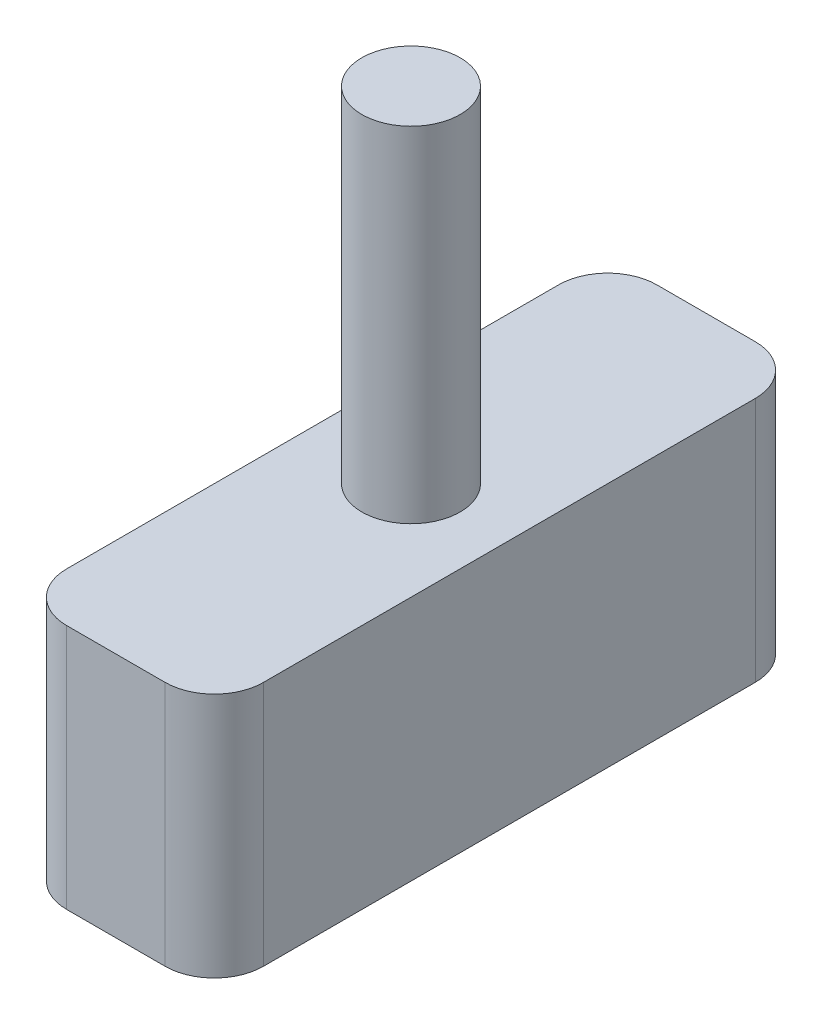
ISO-10303-21;
HEADER;
FILE_DESCRIPTION(('STEP AP214'),'2;1');
FILE_NAME('part.step','',(''),(''),'','','');
FILE_SCHEMA(('AUTOMOTIVE_DESIGN { 1 0 10303 214 1 1 1 1 }'));
ENDSEC;
DATA;
#1=APPLICATION_CONTEXT('core data for automotive mechanical design processes');
#2=APPLICATION_PROTOCOL_DEFINITION('international standard','automotive_design',2000,#1);
#3=PRODUCT_CONTEXT('',#1,'mechanical');
#4=PRODUCT('Part','Part','',(#3));
#5=PRODUCT_RELATED_PRODUCT_CATEGORY('part','',(#4));
#6=PRODUCT_DEFINITION_FORMATION('','',#4);
#7=PRODUCT_DEFINITION_CONTEXT('part definition',#1,'design');
#8=PRODUCT_DEFINITION('design','',#6,#7);
#9=PRODUCT_DEFINITION_SHAPE('','',#8);
#10=(LENGTH_UNIT() NAMED_UNIT(*) SI_UNIT(.MILLI.,.METRE.));
#11=(NAMED_UNIT(*) PLANE_ANGLE_UNIT() SI_UNIT($,.RADIAN.));
#12=(NAMED_UNIT(*) SI_UNIT($,.STERADIAN.) SOLID_ANGLE_UNIT());
#13=UNCERTAINTY_MEASURE_WITH_UNIT(LENGTH_MEASURE(1.E-05),#10,'distance_accuracy_value','');
#14=(GEOMETRIC_REPRESENTATION_CONTEXT(3) GLOBAL_UNCERTAINTY_ASSIGNED_CONTEXT((#13)) GLOBAL_UNIT_ASSIGNED_CONTEXT((#10,
#11,#12)) REPRESENTATION_CONTEXT('',''));
#15=CARTESIAN_POINT('',(0.,0.,0.));
#16=DIRECTION('',(0.,0.,1.));
#17=DIRECTION('',(1.,0.,0.));
#18=AXIS2_PLACEMENT_3D('',#15,#16,#17);
#19=CARTESIAN_POINT('',(0.,7.,0.));
#20=DIRECTION('',(0.,1.,0.));
#21=DIRECTION('',(-1.,0.,0.));
#22=AXIS2_PLACEMENT_3D('',#19,#20,#21);
#23=CYLINDRICAL_SURFACE('',#22,1.);
#24=CARTESIAN_POINT('',(0.,7.,0.));
#25=DIRECTION('',(0.,1.,0.));
#26=DIRECTION('',(-1.,0.,0.));
#27=AXIS2_PLACEMENT_3D('',#24,#25,#26);
#28=CIRCLE('',#27,1.);
#29=CARTESIAN_POINT('',(-1.,7.,0.));
#30=VERTEX_POINT('',#29);
#31=EDGE_CURVE('E11',#30,#30,#28,.T.);
#32=ORIENTED_EDGE('',*,*,#31,.F.);
#33=EDGE_LOOP('',(#32));
#34=FACE_BOUND('',#33,.T.);
#35=CARTESIAN_POINT('',(0.,0.,0.));
#36=DIRECTION('',(0.,1.,0.));
#37=DIRECTION('',(-1.,0.,0.));
#38=AXIS2_PLACEMENT_3D('',#35,#36,#37);
#39=CIRCLE('',#38,1.);
#40=CARTESIAN_POINT('',(-1.,0.,0.));
#41=VERTEX_POINT('',#40);
#42=EDGE_CURVE('E48',#41,#41,#39,.T.);
#43=ORIENTED_EDGE('',*,*,#42,.T.);
#44=EDGE_LOOP('',(#43));
#45=FACE_BOUND('',#44,.T.);
#46=ADVANCED_FACE('F45',(#34,#45),#23,.T.);
#47=CARTESIAN_POINT('',(0.,7.,0.));
#48=DIRECTION('',(0.,-1.,0.));
#49=DIRECTION('',(1.,0.,0.));
#50=AXIS2_PLACEMENT_3D('',#47,#48,#49);
#51=PLANE('',#50);
#52=ORIENTED_EDGE('',*,*,#31,.T.);
#53=EDGE_LOOP('',(#52));
#54=FACE_BOUND('',#53,.T.);
#55=ADVANCED_FACE('F232',(#54),#51,.F.);
#56=CARTESIAN_POINT('',(-2.,-5.,-4.99999999999999));
#57=DIRECTION('',(-1.,0.,0.));
#58=DIRECTION('',(0.,0.,1.));
#59=AXIS2_PLACEMENT_3D('',#56,#57,#58);
#60=PLANE('',#59);
#61=DIRECTION('',(0.,0.,1.));
#62=VECTOR('',#61,1.);
#63=CARTESIAN_POINT('',(-2.,0.,-4.99999999999999));
#64=LINE('',#63,#62);
#65=CARTESIAN_POINT('',(-2.,0.,-4.99999999999999));
#66=VERTEX_POINT('',#65);
#67=CARTESIAN_POINT('',(-2.00000000000001,0.,5.00000000000002));
#68=VERTEX_POINT('',#67);
#69=EDGE_CURVE('E147',#66,#68,#64,.T.);
#70=ORIENTED_EDGE('',*,*,#69,.F.);
#71=DIRECTION('',(0.,1.,0.));
#72=VECTOR('',#71,1.);
#73=CARTESIAN_POINT('',(-2.,-5.,-4.99999999999999));
#74=LINE('',#73,#72);
#75=CARTESIAN_POINT('',(-2.,-5.,-4.99999999999999));
#76=VERTEX_POINT('',#75);
#77=EDGE_CURVE('E62',#76,#66,#74,.T.);
#78=ORIENTED_EDGE('',*,*,#77,.F.);
#79=DIRECTION('',(0.,0.,1.));
#80=VECTOR('',#79,1.);
#81=CARTESIAN_POINT('',(-2.,-5.,-4.99999999999999));
#82=LINE('',#81,#80);
#83=CARTESIAN_POINT('',(-2.00000000000001,-5.,5.00000000000002));
#84=VERTEX_POINT('',#83);
#85=EDGE_CURVE('E173',#76,#84,#82,.T.);
#86=ORIENTED_EDGE('',*,*,#85,.T.);
#87=DIRECTION('',(0.,1.,0.));
#88=VECTOR('',#87,1.);
#89=CARTESIAN_POINT('',(-2.00000000000001,-5.,5.00000000000002));
#90=LINE('',#89,#88);
#91=EDGE_CURVE('E103',#84,#68,#90,.T.);
#92=ORIENTED_EDGE('',*,*,#91,.T.);
#93=EDGE_LOOP('',(#70,#78,#86,#92));
#94=FACE_BOUND('',#93,.T.);
#95=ADVANCED_FACE('F192',(#94),#60,.T.);
#96=CARTESIAN_POINT('',(-1.,-5.,-4.99999999999999));
#97=DIRECTION('',(0.,1.,0.));
#98=DIRECTION('',(-1.,0.,0.));
#99=AXIS2_PLACEMENT_3D('',#96,#97,#98);
#100=CYLINDRICAL_SURFACE('',#99,1.);
#101=CARTESIAN_POINT('',(-1.,0.,-4.99999999999999));
#102=DIRECTION('',(0.,-1.,0.));
#103=DIRECTION('',(1.,0.,0.));
#104=AXIS2_PLACEMENT_3D('',#101,#102,#103);
#105=CIRCLE('',#104,1.);
#106=CARTESIAN_POINT('',(-1.,0.,-5.99999999999999));
#107=VERTEX_POINT('',#106);
#108=EDGE_CURVE('E170',#66,#107,#105,.T.);
#109=ORIENTED_EDGE('',*,*,#108,.T.);
#110=DIRECTION('',(0.,1.,0.));
#111=VECTOR('',#110,1.);
#112=CARTESIAN_POINT('',(-1.,-5.,-5.99999999999999));
#113=LINE('',#112,#111);
#114=CARTESIAN_POINT('',(-1.,-5.,-5.99999999999999));
#115=VERTEX_POINT('',#114);
#116=EDGE_CURVE('E92',#115,#107,#113,.T.);
#117=ORIENTED_EDGE('',*,*,#116,.F.);
#118=CARTESIAN_POINT('',(-1.,-5.,-4.99999999999999));
#119=DIRECTION('',(0.,-1.,0.));
#120=DIRECTION('',(1.,0.,0.));
#121=AXIS2_PLACEMENT_3D('',#118,#119,#120);
#122=CIRCLE('',#121,1.);
#123=EDGE_CURVE('E140',#76,#115,#122,.T.);
#124=ORIENTED_EDGE('',*,*,#123,.F.);
#125=ORIENTED_EDGE('',*,*,#77,.T.);
#126=EDGE_LOOP('',(#109,#117,#124,#125));
#127=FACE_BOUND('',#126,.T.);
#128=ADVANCED_FACE('F198',(#127),#100,.T.);
#129=CARTESIAN_POINT('',(1.,-5.,-5.99999999999999));
#130=DIRECTION('',(0.,0.,-1.));
#131=DIRECTION('',(-1.,0.,0.));
#132=AXIS2_PLACEMENT_3D('',#129,#130,#131);
#133=PLANE('',#132);
#134=DIRECTION('',(-1.,0.,0.));
#135=VECTOR('',#134,1.);
#136=CARTESIAN_POINT('',(1.,0.,-5.99999999999999));
#137=LINE('',#136,#135);
#138=CARTESIAN_POINT('',(1.,0.,-5.99999999999999));
#139=VERTEX_POINT('',#138);
#140=EDGE_CURVE('E123',#139,#107,#137,.T.);
#141=ORIENTED_EDGE('',*,*,#140,.F.);
#142=DIRECTION('',(0.,1.,0.));
#143=VECTOR('',#142,1.);
#144=CARTESIAN_POINT('',(1.,-5.,-5.99999999999999));
#145=LINE('',#144,#143);
#146=CARTESIAN_POINT('',(1.,-5.,-5.99999999999999));
#147=VERTEX_POINT('',#146);
#148=EDGE_CURVE('E117',#147,#139,#145,.T.);
#149=ORIENTED_EDGE('',*,*,#148,.F.);
#150=DIRECTION('',(-1.,0.,0.));
#151=VECTOR('',#150,1.);
#152=CARTESIAN_POINT('',(1.,-5.,-5.99999999999999));
#153=LINE('',#152,#151);
#154=EDGE_CURVE('E121',#147,#115,#153,.T.);
#155=ORIENTED_EDGE('',*,*,#154,.T.);
#156=ORIENTED_EDGE('',*,*,#116,.T.);
#157=EDGE_LOOP('',(#141,#149,#155,#156));
#158=FACE_BOUND('',#157,.T.);
#159=ADVANCED_FACE('F119',(#158),#133,.T.);
#160=CARTESIAN_POINT('',(1.,-5.,-4.99999999999999));
#161=DIRECTION('',(0.,1.,0.));
#162=DIRECTION('',(-1.,0.,0.));
#163=AXIS2_PLACEMENT_3D('',#160,#161,#162);
#164=CYLINDRICAL_SURFACE('',#163,1.);
#165=CARTESIAN_POINT('',(1.,0.,-4.99999999999999));
#166=DIRECTION('',(0.,-1.,0.));
#167=DIRECTION('',(1.,0.,0.));
#168=AXIS2_PLACEMENT_3D('',#165,#166,#167);
#169=CIRCLE('',#168,1.);
#170=CARTESIAN_POINT('',(2.,0.,-4.99999999999999));
#171=VERTEX_POINT('',#170);
#172=EDGE_CURVE('E165',#139,#171,#169,.T.);
#173=ORIENTED_EDGE('',*,*,#172,.T.);
#174=DIRECTION('',(0.,1.,0.));
#175=VECTOR('',#174,1.);
#176=CARTESIAN_POINT('',(2.,-5.,-4.99999999999999));
#177=LINE('',#176,#175);
#178=CARTESIAN_POINT('',(2.,-5.,-4.99999999999999));
#179=VERTEX_POINT('',#178);
#180=EDGE_CURVE('E127',#179,#171,#177,.T.);
#181=ORIENTED_EDGE('',*,*,#180,.F.);
#182=CARTESIAN_POINT('',(1.,-5.,-4.99999999999999));
#183=DIRECTION('',(0.,-1.,0.));
#184=DIRECTION('',(1.,0.,0.));
#185=AXIS2_PLACEMENT_3D('',#182,#183,#184);
#186=CIRCLE('',#185,1.);
#187=EDGE_CURVE('E130',#147,#179,#186,.T.);
#188=ORIENTED_EDGE('',*,*,#187,.F.);
#189=ORIENTED_EDGE('',*,*,#148,.T.);
#190=EDGE_LOOP('',(#173,#181,#188,#189));
#191=FACE_BOUND('',#190,.T.);
#192=ADVANCED_FACE('F131',(#191),#164,.T.);
#193=CARTESIAN_POINT('',(2.,-5.,-4.99999999999999));
#194=DIRECTION('',(-1.,0.,0.));
#195=DIRECTION('',(0.,-1.,0.));
#196=AXIS2_PLACEMENT_3D('',#193,#194,#195);
#197=PLANE('',#196);
#198=DIRECTION('',(0.,0.,1.));
#199=VECTOR('',#198,1.);
#200=CARTESIAN_POINT('',(2.,0.,-4.99999999999999));
#201=LINE('',#200,#199);
#202=CARTESIAN_POINT('',(2.,0.,5.00000000000002));
#203=VERTEX_POINT('',#202);
#204=EDGE_CURVE('E162',#171,#203,#201,.T.);
#205=ORIENTED_EDGE('',*,*,#204,.T.);
#206=DIRECTION('',(0.,1.,0.));
#207=VECTOR('',#206,1.);
#208=CARTESIAN_POINT('',(2.,-5.,5.00000000000002));
#209=LINE('',#208,#207);
#210=CARTESIAN_POINT('',(2.,-5.,5.00000000000002));
#211=VERTEX_POINT('',#210);
#212=EDGE_CURVE('E180',#211,#203,#209,.T.);
#213=ORIENTED_EDGE('',*,*,#212,.F.);
#214=DIRECTION('',(0.,0.,1.));
#215=VECTOR('',#214,1.);
#216=CARTESIAN_POINT('',(2.,-5.,-4.99999999999999));
#217=LINE('',#216,#215);
#218=EDGE_CURVE('E136',#179,#211,#217,.T.);
#219=ORIENTED_EDGE('',*,*,#218,.F.);
#220=ORIENTED_EDGE('',*,*,#180,.T.);
#221=EDGE_LOOP('',(#205,#213,#219,#220));
#222=FACE_BOUND('',#221,.T.);
#223=ADVANCED_FACE('F215',(#222),#197,.F.);
#224=CARTESIAN_POINT('',(1.,-5.,5.00000000000002));
#225=DIRECTION('',(0.,1.,0.));
#226=DIRECTION('',(-1.,0.,0.));
#227=AXIS2_PLACEMENT_3D('',#224,#225,#226);
#228=CYLINDRICAL_SURFACE('',#227,1.);
#229=CARTESIAN_POINT('',(1.,0.,5.00000000000002));
#230=DIRECTION('',(0.,-1.,0.));
#231=DIRECTION('',(1.,0.,0.));
#232=AXIS2_PLACEMENT_3D('',#229,#230,#231);
#233=CIRCLE('',#232,1.);
#234=CARTESIAN_POINT('',(1.,0.,6.00000000000002));
#235=VERTEX_POINT('',#234);
#236=EDGE_CURVE('E159',#203,#235,#233,.T.);
#237=ORIENTED_EDGE('',*,*,#236,.T.);
#238=DIRECTION('',(0.,1.,0.));
#239=VECTOR('',#238,1.);
#240=CARTESIAN_POINT('',(1.,-5.,6.00000000000002));
#241=LINE('',#240,#239);
#242=CARTESIAN_POINT('',(1.,-5.,6.00000000000002));
#243=VERTEX_POINT('',#242);
#244=EDGE_CURVE('E184',#243,#235,#241,.T.);
#245=ORIENTED_EDGE('',*,*,#244,.F.);
#246=CARTESIAN_POINT('',(1.,-5.,5.00000000000002));
#247=DIRECTION('',(0.,-1.,0.));
#248=DIRECTION('',(1.,0.,0.));
#249=AXIS2_PLACEMENT_3D('',#246,#247,#248);
#250=CIRCLE('',#249,1.);
#251=EDGE_CURVE('E208',#211,#243,#250,.T.);
#252=ORIENTED_EDGE('',*,*,#251,.F.);
#253=ORIENTED_EDGE('',*,*,#212,.T.);
#254=EDGE_LOOP('',(#237,#245,#252,#253));
#255=FACE_BOUND('',#254,.T.);
#256=ADVANCED_FACE('F219',(#255),#228,.T.);
#257=CARTESIAN_POINT('',(1.,-5.,6.00000000000002));
#258=DIRECTION('',(0.,0.,-1.));
#259=DIRECTION('',(-1.,0.,0.));
#260=AXIS2_PLACEMENT_3D('',#257,#258,#259);
#261=PLANE('',#260);
#262=DIRECTION('',(-1.,0.,0.));
#263=VECTOR('',#262,1.);
#264=CARTESIAN_POINT('',(1.,0.,6.00000000000002));
#265=LINE('',#264,#263);
#266=CARTESIAN_POINT('',(-1.00000000000001,0.,6.00000000000002));
#267=VERTEX_POINT('',#266);
#268=EDGE_CURVE('E155',#235,#267,#265,.T.);
#269=ORIENTED_EDGE('',*,*,#268,.T.);
#270=DIRECTION('',(0.,1.,0.));
#271=VECTOR('',#270,1.);
#272=CARTESIAN_POINT('',(-1.00000000000001,-5.,6.00000000000002));
#273=LINE('',#272,#271);
#274=CARTESIAN_POINT('',(-1.00000000000001,-5.,6.00000000000002));
#275=VERTEX_POINT('',#274);
#276=EDGE_CURVE('E188',#275,#267,#273,.T.);
#277=ORIENTED_EDGE('',*,*,#276,.F.);
#278=DIRECTION('',(-1.,0.,0.));
#279=VECTOR('',#278,1.);
#280=CARTESIAN_POINT('',(1.,-5.,6.00000000000002));
#281=LINE('',#280,#279);
#282=EDGE_CURVE('E203',#243,#275,#281,.T.);
#283=ORIENTED_EDGE('',*,*,#282,.F.);
#284=ORIENTED_EDGE('',*,*,#244,.T.);
#285=EDGE_LOOP('',(#269,#277,#283,#284));
#286=FACE_BOUND('',#285,.T.);
#287=ADVANCED_FACE('F222',(#286),#261,.F.);
#288=CARTESIAN_POINT('',(-1.00000000000001,-5.,5.00000000000002));
#289=DIRECTION('',(0.,1.,0.));
#290=DIRECTION('',(-1.,0.,0.));
#291=AXIS2_PLACEMENT_3D('',#288,#289,#290);
#292=CYLINDRICAL_SURFACE('',#291,1.);
#293=CARTESIAN_POINT('',(-1.00000000000001,0.,5.00000000000002));
#294=DIRECTION('',(0.,1.,0.));
#295=DIRECTION('',(-1.,0.,0.));
#296=AXIS2_PLACEMENT_3D('',#293,#294,#295);
#297=CIRCLE('',#296,1.);
#298=EDGE_CURVE('E151',#68,#267,#297,.T.);
#299=ORIENTED_EDGE('',*,*,#298,.F.);
#300=ORIENTED_EDGE('',*,*,#91,.F.);
#301=CARTESIAN_POINT('',(-1.00000000000001,-5.,5.00000000000002));
#302=DIRECTION('',(0.,1.,0.));
#303=DIRECTION('',(-1.,0.,0.));
#304=AXIS2_PLACEMENT_3D('',#301,#302,#303);
#305=CIRCLE('',#304,1.);
#306=EDGE_CURVE('E199',#84,#275,#305,.T.);
#307=ORIENTED_EDGE('',*,*,#306,.T.);
#308=ORIENTED_EDGE('',*,*,#276,.T.);
#309=EDGE_LOOP('',(#299,#300,#307,#308));
#310=FACE_BOUND('',#309,.T.);
#311=ADVANCED_FACE('F193',(#310),#292,.T.);
#312=CARTESIAN_POINT('',(-1.00000000000001,-5.,5.00000000000002));
#313=DIRECTION('',(0.,1.,0.));
#314=DIRECTION('',(-1.,0.,0.));
#315=AXIS2_PLACEMENT_3D('',#312,#313,#314);
#316=PLANE('',#315);
#317=ORIENTED_EDGE('',*,*,#85,.F.);
#318=ORIENTED_EDGE('',*,*,#123,.T.);
#319=ORIENTED_EDGE('',*,*,#154,.F.);
#320=ORIENTED_EDGE('',*,*,#187,.T.);
#321=ORIENTED_EDGE('',*,*,#218,.T.);
#322=ORIENTED_EDGE('',*,*,#251,.T.);
#323=ORIENTED_EDGE('',*,*,#282,.T.);
#324=ORIENTED_EDGE('',*,*,#306,.F.);
#325=EDGE_LOOP('',(#317,#318,#319,#320,#321,#322,#323,#324));
#326=FACE_BOUND('',#325,.T.);
#327=ADVANCED_FACE('F139',(#326),#316,.F.);
#328=CARTESIAN_POINT('',(-1.00000000000001,0.,5.00000000000002));
#329=DIRECTION('',(0.,1.,0.));
#330=DIRECTION('',(-1.,0.,0.));
#331=AXIS2_PLACEMENT_3D('',#328,#329,#330);
#332=PLANE('',#331);
#333=ORIENTED_EDGE('',*,*,#42,.F.);
#334=EDGE_LOOP('',(#333));
#335=FACE_BOUND('',#334,.T.);
#336=ORIENTED_EDGE('',*,*,#69,.T.);
#337=ORIENTED_EDGE('',*,*,#298,.T.);
#338=ORIENTED_EDGE('',*,*,#268,.F.);
#339=ORIENTED_EDGE('',*,*,#236,.F.);
#340=ORIENTED_EDGE('',*,*,#204,.F.);
#341=ORIENTED_EDGE('',*,*,#172,.F.);
#342=ORIENTED_EDGE('',*,*,#140,.T.);
#343=ORIENTED_EDGE('',*,*,#108,.F.);
#344=EDGE_LOOP('',(#336,#337,#338,#339,#340,#341,#342,#343));
#345=FACE_BOUND('',#344,.T.);
#346=ADVANCED_FACE('F197',(#335,#345),#332,.T.);
#347=CLOSED_SHELL('',(#46,#55,#95,#128,#159,#192,#223,#256,#287,#311,#327,#346));
#348=MANIFOLD_SOLID_BREP('B2',#347);
#349=ADVANCED_BREP_SHAPE_REPRESENTATION('',(#18,#348),#14);
#350=SHAPE_DEFINITION_REPRESENTATION(#9,#349);
ENDSEC;
END-ISO-10303-21;
